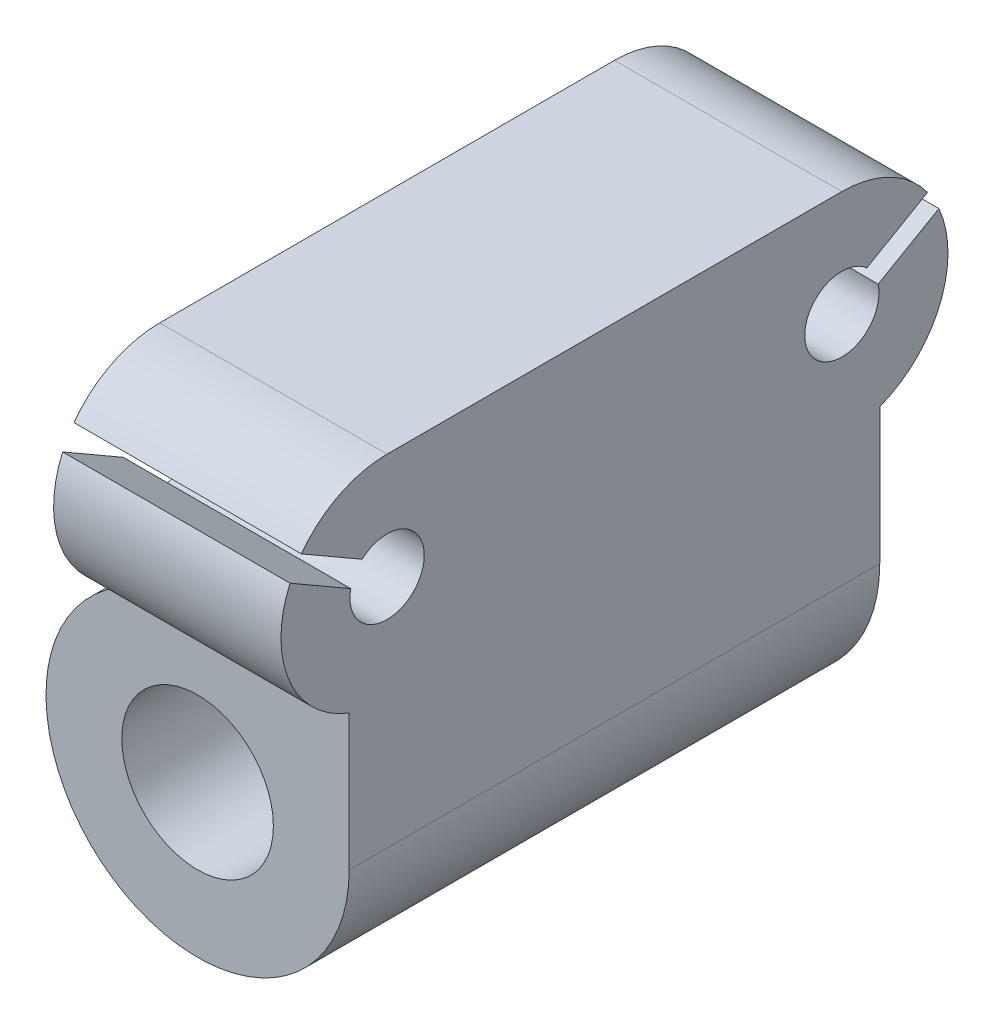
ISO-10303-21;
HEADER;
FILE_DESCRIPTION(('STEP AP214'),'2;1');
FILE_NAME('part.step','',(''),(''),'','','');
FILE_SCHEMA(('AUTOMOTIVE_DESIGN { 1 0 10303 214 1 1 1 1 }'));
ENDSEC;
DATA;
#1=APPLICATION_CONTEXT('core data for automotive mechanical design processes');
#2=APPLICATION_PROTOCOL_DEFINITION('international standard','automotive_design',2000,#1);
#3=PRODUCT_CONTEXT('',#1,'mechanical');
#4=PRODUCT('Part','Part','',(#3));
#5=PRODUCT_RELATED_PRODUCT_CATEGORY('part','',(#4));
#6=PRODUCT_DEFINITION_FORMATION('','',#4);
#7=PRODUCT_DEFINITION_CONTEXT('part definition',#1,'design');
#8=PRODUCT_DEFINITION('design','',#6,#7);
#9=PRODUCT_DEFINITION_SHAPE('','',#8);
#10=(LENGTH_UNIT() NAMED_UNIT(*) SI_UNIT(.MILLI.,.METRE.));
#11=(NAMED_UNIT(*) PLANE_ANGLE_UNIT() SI_UNIT($,.RADIAN.));
#12=(NAMED_UNIT(*) SI_UNIT($,.STERADIAN.) SOLID_ANGLE_UNIT());
#13=UNCERTAINTY_MEASURE_WITH_UNIT(LENGTH_MEASURE(1.E-05),#10,'distance_accuracy_value','');
#14=(GEOMETRIC_REPRESENTATION_CONTEXT(3) GLOBAL_UNCERTAINTY_ASSIGNED_CONTEXT((#13)) GLOBAL_UNIT_ASSIGNED_CONTEXT((#10,
#11,#12)) REPRESENTATION_CONTEXT('',''));
#15=CARTESIAN_POINT('',(0.,0.,0.));
#16=DIRECTION('',(0.,0.,1.));
#17=DIRECTION('',(1.,0.,0.));
#18=AXIS2_PLACEMENT_3D('',#15,#16,#17);
#19=CARTESIAN_POINT('',(10.,15.5,2.5));
#20=DIRECTION('',(-1.,0.,0.));
#21=DIRECTION('',(0.,-1.,0.));
#22=AXIS2_PLACEMENT_3D('',#19,#20,#21);
#23=CYLINDRICAL_SURFACE('',#22,7.);
#24=DIRECTION('',(-1.,0.,0.));
#25=VECTOR('',#24,1.);
#26=CARTESIAN_POINT('',(10.,19.6293717796071,-3.1522817256206));
#27=LINE('',#26,#25);
#28=CARTESIAN_POINT('',(-4.99999999999999,19.6293717796071,-3.1522817256206));
#29=VERTEX_POINT('',#28);
#30=CARTESIAN_POINT('',(10.,19.6293717796071,-3.1522817256206));
#31=VERTEX_POINT('',#30);
#32=EDGE_CURVE('E131',#29,#31,#27,.F.);
#33=ORIENTED_EDGE('',*,*,#32,.F.);
#34=CARTESIAN_POINT('',(-5.,15.5,2.5));
#35=DIRECTION('',(-1.,0.,0.));
#36=DIRECTION('',(0.,-1.,0.));
#37=AXIS2_PLACEMENT_3D('',#34,#35,#36);
#38=CIRCLE('',#37,7.);
#39=CARTESIAN_POINT('',(-4.99999999999999,22.5,2.5));
#40=VERTEX_POINT('',#39);
#41=EDGE_CURVE('E258',#40,#29,#38,.T.);
#42=ORIENTED_EDGE('',*,*,#41,.F.);
#43=DIRECTION('',(-1.,0.,0.));
#44=VECTOR('',#43,1.);
#45=CARTESIAN_POINT('',(10.,22.5,2.5));
#46=LINE('',#45,#44);
#47=CARTESIAN_POINT('',(10.,22.5,2.5));
#48=VERTEX_POINT('',#47);
#49=EDGE_CURVE('E153',#48,#40,#46,.T.);
#50=ORIENTED_EDGE('',*,*,#49,.F.);
#51=CARTESIAN_POINT('',(10.,15.5,2.5));
#52=DIRECTION('',(-1.,0.,0.));
#53=DIRECTION('',(0.,-1.,0.));
#54=AXIS2_PLACEMENT_3D('',#51,#52,#53);
#55=CIRCLE('',#54,7.);
#56=EDGE_CURVE('E146',#48,#31,#55,.T.);
#57=ORIENTED_EDGE('',*,*,#56,.T.);
#58=EDGE_LOOP('',(#33,#42,#50,#57));
#59=FACE_BOUND('',#58,.T.);
#60=ADVANCED_FACE('F32',(#59),#23,.T.);
#61=CARTESIAN_POINT('',(10.,15.5,32.5));
#62=DIRECTION('',(-1.,0.,0.));
#63=DIRECTION('',(0.,-1.,0.));
#64=AXIS2_PLACEMENT_3D('',#61,#62,#63);
#65=CYLINDRICAL_SURFACE('',#64,7.);
#66=DIRECTION('',(-1.,0.,0.));
#67=VECTOR('',#66,1.);
#68=CARTESIAN_POINT('',(10.,19.6293717796071,38.1522817256206));
#69=LINE('',#68,#67);
#70=CARTESIAN_POINT('',(10.,19.6293717796071,38.1522817256206));
#71=VERTEX_POINT('',#70);
#72=CARTESIAN_POINT('',(-4.99999999999999,19.6293717796071,38.1522817256206));
#73=VERTEX_POINT('',#72);
#74=EDGE_CURVE('E237',#71,#73,#69,.T.);
#75=ORIENTED_EDGE('',*,*,#74,.F.);
#76=CARTESIAN_POINT('',(10.,15.5,32.5));
#77=DIRECTION('',(-1.,0.,0.));
#78=DIRECTION('',(0.,-1.,0.));
#79=AXIS2_PLACEMENT_3D('',#76,#77,#78);
#80=CIRCLE('',#79,7.);
#81=CARTESIAN_POINT('',(10.,22.5,32.5));
#82=VERTEX_POINT('',#81);
#83=EDGE_CURVE('E154',#71,#82,#80,.T.);
#84=ORIENTED_EDGE('',*,*,#83,.T.);
#85=DIRECTION('',(-1.,0.,0.));
#86=VECTOR('',#85,1.);
#87=CARTESIAN_POINT('',(10.,22.5,32.5));
#88=LINE('',#87,#86);
#89=CARTESIAN_POINT('',(-4.99999999999999,22.5,32.5));
#90=VERTEX_POINT('',#89);
#91=EDGE_CURVE('E166',#82,#90,#88,.T.);
#92=ORIENTED_EDGE('',*,*,#91,.T.);
#93=CARTESIAN_POINT('',(-5.,15.5,32.5));
#94=DIRECTION('',(-1.,0.,0.));
#95=DIRECTION('',(0.,-1.,0.));
#96=AXIS2_PLACEMENT_3D('',#93,#94,#95);
#97=CIRCLE('',#96,7.);
#98=EDGE_CURVE('E240',#73,#90,#97,.T.);
#99=ORIENTED_EDGE('',*,*,#98,.F.);
#100=EDGE_LOOP('',(#75,#84,#92,#99));
#101=FACE_BOUND('',#100,.T.);
#102=ADVANCED_FACE('F189',(#101),#65,.T.);
#103=CARTESIAN_POINT('',(0.,0.,0.));
#104=DIRECTION('',(0.,0.,1.));
#105=DIRECTION('',(1.,0.,0.));
#106=AXIS2_PLACEMENT_3D('',#103,#104,#105);
#107=PLANE('',#106);
#108=CARTESIAN_POINT('',(0.,0.,0.));
#109=DIRECTION('',(0.,0.,1.));
#110=DIRECTION('',(1.,0.,0.));
#111=AXIS2_PLACEMENT_3D('',#108,#109,#110);
#112=CIRCLE('',#111,10.);
#113=CARTESIAN_POINT('',(-4.43720642686828,8.961651584689,0.));
#114=VERTEX_POINT('',#113);
#115=CARTESIAN_POINT('',(10.,0.,0.));
#116=VERTEX_POINT('',#115);
#117=EDGE_CURVE('E297',#114,#116,#112,.T.);
#118=ORIENTED_EDGE('',*,*,#117,.F.);
#119=DIRECTION('',(-1.,0.,0.));
#120=VECTOR('',#119,1.);
#121=CARTESIAN_POINT('',(10.,8.96165158468899,0.));
#122=LINE('',#121,#120);
#123=CARTESIAN_POINT('',(10.,8.96165158468899,0.));
#124=VERTEX_POINT('',#123);
#125=EDGE_CURVE('E320',#114,#124,#122,.F.);
#126=ORIENTED_EDGE('',*,*,#125,.T.);
#127=DIRECTION('',(0.,1.,0.));
#128=VECTOR('',#127,1.);
#129=CARTESIAN_POINT('',(10.,12.,0.));
#130=LINE('',#129,#128);
#131=EDGE_CURVE('E292',#116,#124,#130,.T.);
#132=ORIENTED_EDGE('',*,*,#131,.F.);
#133=EDGE_LOOP('',(#118,#126,#132));
#134=FACE_BOUND('',#133,.T.);
#135=CARTESIAN_POINT('',(0.,0.,0.));
#136=DIRECTION('',(0.,0.,1.));
#137=DIRECTION('',(1.,0.,0.));
#138=AXIS2_PLACEMENT_3D('',#135,#136,#137);
#139=CIRCLE('',#138,5.);
#140=CARTESIAN_POINT('',(5.,0.,0.));
#141=VERTEX_POINT('',#140);
#142=EDGE_CURVE('E301',#141,#141,#139,.T.);
#143=ORIENTED_EDGE('',*,*,#142,.T.);
#144=EDGE_LOOP('',(#143));
#145=FACE_BOUND('',#144,.T.);
#146=ADVANCED_FACE('F220',(#134,#145),#107,.F.);
#147=CARTESIAN_POINT('',(0.,0.,15.));
#148=DIRECTION('',(0.,0.,-1.));
#149=DIRECTION('',(-1.,0.,0.));
#150=AXIS2_PLACEMENT_3D('',#147,#148,#149);
#151=CYLINDRICAL_SURFACE('',#150,10.);
#152=DIRECTION('',(0.,0.,-1.));
#153=VECTOR('',#152,1.);
#154=CARTESIAN_POINT('',(-5.,8.66025403784439,15.));
#155=LINE('',#154,#153);
#156=CARTESIAN_POINT('',(-5.,8.66025403784439,33.9892532266797));
#157=VERTEX_POINT('',#156);
#158=CARTESIAN_POINT('',(-5.,8.66025403784439,1.0107467733203));
#159=VERTEX_POINT('',#158);
#160=EDGE_CURVE('E307',#157,#159,#155,.T.);
#161=ORIENTED_EDGE('',*,*,#160,.T.);
#162=CARTESIAN_POINT('',(0.,10.,6.83012701892219));
#163=CARTESIAN_POINT('',(-0.159285536581169,10.0000240749592,6.83010068400524));
#164=CARTESIAN_POINT('',(-0.318579521881655,9.99619505366448,6.8252919494851));
#165=CARTESIAN_POINT('',(-0.636265460919561,9.98099871756684,6.80591555210003));
#166=CARTESIAN_POINT('',(-0.794657083151019,9.96962879249385,6.79134451001245));
#167=CARTESIAN_POINT('',(-1.11055138359528,9.93941895499326,6.75211952397573));
#168=CARTESIAN_POINT('',(-1.26804120633403,9.92053001787747,6.72739937296773));
#169=CARTESIAN_POINT('',(-1.5799852396837,9.87565005217115,6.66750497286993));
#170=CARTESIAN_POINT('',(-1.73443973693079,9.84965969767994,6.63233171600945));
#171=CARTESIAN_POINT('',(-2.03965635319013,9.79101745243971,6.55093073860382));
#172=CARTESIAN_POINT('',(-2.19040562597617,9.7583452788368,6.50466928417913));
#173=CARTESIAN_POINT('',(-2.48643393890001,9.68714704419364,6.40060442061861));
#174=CARTESIAN_POINT('',(-2.63171366229081,9.64862171737385,6.34280245884055));
#175=CARTESIAN_POINT('',(-2.91502656183302,9.56683230180569,6.21527111150424));
#176=CARTESIAN_POINT('',(-3.05308006571003,9.52358269472148,6.1455778275153));
#177=CARTESIAN_POINT('',(-3.32085021420594,9.43355350165217,5.9937100514578));
#178=CARTESIAN_POINT('',(-3.45056957915447,9.38677507845176,5.91153966177479));
#179=CARTESIAN_POINT('',(-3.76436507213043,9.26662465684196,5.688775035512));
#180=CARTESIAN_POINT('',(-3.94214979637995,9.19193120036068,5.53984666713701));
#181=CARTESIAN_POINT('',(-4.26958960375021,9.04449761606714,5.21265285377202));
#182=CARTESIAN_POINT('',(-4.4192515179283,8.97175701759283,5.03439455283316));
#183=CARTESIAN_POINT('',(-4.61911700914336,8.86958003417728,4.74678200148933));
#184=CARTESIAN_POINT('',(-4.68180165952128,8.83657837820945,4.64717402822783));
#185=CARTESIAN_POINT('',(-4.7982451212605,8.77389330911268,4.44190063329431));
#186=CARTESIAN_POINT('',(-4.85200793707445,8.74420840926496,4.33623795800421));
#187=CARTESIAN_POINT('',(-4.95016288801224,8.68901983791034,4.11958382679643));
#188=CARTESIAN_POINT('',(-4.9945536954294,8.66351675894466,4.00859161858861));
#189=CARTESIAN_POINT('',(-5.07359883611428,8.61746424921465,3.78220000804186));
#190=CARTESIAN_POINT('',(-5.10825418169739,8.59691430344389,3.6668010653437));
#191=CARTESIAN_POINT('',(-5.16453142929958,8.56321065505971,3.44459747752463));
#192=CARTESIAN_POINT('',(-5.18712311413293,8.54951583994371,3.33811914985197));
#193=CARTESIAN_POINT('',(-5.2241203214549,8.52695950272027,3.12320255180967));
#194=CARTESIAN_POINT('',(-5.23852309716318,8.51809960241329,3.0147636363757));
#195=CARTESIAN_POINT('',(-5.25903610262079,8.50545028750099,2.79692739573547));
#196=CARTESIAN_POINT('',(-5.26515507131983,8.50165552951534,2.68753120325844));
#197=CARTESIAN_POINT('',(-5.26909565885739,8.49921390584813,2.46849262407644));
#198=CARTESIAN_POINT('',(-5.26691444760798,8.50056879602676,2.35885016614034));
#199=CARTESIAN_POINT('',(-5.25457696747006,8.50820008273864,2.14568924104742));
#200=CARTESIAN_POINT('',(-5.24482404882832,8.51422754486129,2.04213817618118));
#201=CARTESIAN_POINT('',(-5.21788386143233,8.53076418845414,1.836369836865));
#202=CARTESIAN_POINT('',(-5.20069663228618,8.54127334604701,1.734152555312));
#203=CARTESIAN_POINT('',(-5.15896020512079,8.5665468017578,1.53167935507928));
#204=CARTESIAN_POINT('',(-5.13440484749261,8.58131465966067,1.4314251524862));
#205=CARTESIAN_POINT('',(-5.0780799366756,8.614764967294,1.23366963844932));
#206=CARTESIAN_POINT('',(-5.04631259659419,8.63344621600485,1.13616749279293));
#207=CARTESIAN_POINT('',(-4.97621583577044,8.67403552377071,0.945794570202875));
#208=CARTESIAN_POINT('',(-4.93798039129137,8.69589681808487,0.852879148007061));
#209=CARTESIAN_POINT('',(-4.85487845275328,8.7425639989204,0.670821815743872));
#210=CARTESIAN_POINT('',(-4.81001131312369,8.76737017206831,0.581680274137587));
#211=CARTESIAN_POINT('',(-4.71396399472668,8.8193832049613,0.407731857292472));
#212=CARTESIAN_POINT('',(-4.66279025903223,8.84658760661953,0.322920681263477));
#213=CARTESIAN_POINT('',(-4.55442953945422,8.90285912331537,0.157915897270163));
#214=CARTESIAN_POINT('',(-4.49724425531008,8.93192571092494,0.0777209939461665));
#215=CARTESIAN_POINT('',(-4.43720642686832,8.961651584689,0.));
#216=B_SPLINE_CURVE_WITH_KNOTS('',3,(#162,#163,#164,#165,#166,#167,#168,#169,#170,#171,#172,
#173,#174,#175,#176,#177,#178,#179,#180,#181,#182,#183,#184,#185,#186,#187,#188,#189,#190,#191,
#192,#193,#194,#195,#196,#197,#198,#199,#200,#201,#202,#203,#204,#205,#206,#207,#208,#209,#210,
#211,#212,#213,#214,#215),.UNSPECIFIED.,.F.,.F.,(4,2,2,2,2,2,2,2,2,2,2,2,2,2,2,2,2,2,2,2,2,2,2,
2,2,2,4),(0.,0.47775187523151,0.955669209769702,1.43675503559307,1.9177952103842,
2.40031786770465,2.88278004720566,3.36380273830759,3.84466761359355,4.57244994148511,
5.30005526119392,5.66630842693191,6.03239675732493,6.39853691569718,6.76463898788226,
7.09334176530692,7.42215473353527,7.75062055159165,8.07919837570526,8.39138162494116,
8.70356321096504,9.01600650514239,9.32835405058972,9.63650180660839,9.94467957943223,
10.2525450756292,10.5603237571244),.UNSPECIFIED.);
#217=EDGE_CURVE('E176',#159,#114,#216,.T.);
#218=ORIENTED_EDGE('',*,*,#217,.T.);
#219=ORIENTED_EDGE('',*,*,#117,.T.);
#220=DIRECTION('',(0.,0.,-1.));
#221=VECTOR('',#220,1.);
#222=CARTESIAN_POINT('',(10.,0.,15.));
#223=LINE('',#222,#221);
#224=CARTESIAN_POINT('',(10.,0.,35.));
#225=VERTEX_POINT('',#224);
#226=EDGE_CURVE('E295',#225,#116,#223,.T.);
#227=ORIENTED_EDGE('',*,*,#226,.F.);
#228=CARTESIAN_POINT('',(0.,0.,35.));
#229=DIRECTION('',(0.,0.,1.));
#230=DIRECTION('',(1.,0.,0.));
#231=AXIS2_PLACEMENT_3D('',#228,#229,#230);
#232=CIRCLE('',#231,10.);
#233=CARTESIAN_POINT('',(-4.43720642686829,8.961651584689,35.));
#234=VERTEX_POINT('',#233);
#235=EDGE_CURVE('E327',#234,#225,#232,.T.);
#236=ORIENTED_EDGE('',*,*,#235,.F.);
#237=CARTESIAN_POINT('',(-4.43720642686828,8.961651584689,35.));
#238=CARTESIAN_POINT('',(-4.49983236729145,8.9306442708212,34.9189321149927));
#239=CARTESIAN_POINT('',(-4.55935328693936,8.90035498844151,34.8351695624002));
#240=CARTESIAN_POINT('',(-4.67184284287587,8.84182689712593,34.6626364399322));
#241=CARTESIAN_POINT('',(-4.72480932591941,8.81358876327923,34.5738642381723));
#242=CARTESIAN_POINT('',(-4.82386108697644,8.75976872347597,34.3916459242092));
#243=CARTESIAN_POINT('',(-4.86993867726907,8.73418979463446,34.2981947433699));
#244=CARTESIAN_POINT('',(-4.95484028099788,8.68630728293303,34.1072568245827));
#245=CARTESIAN_POINT('',(-4.99366521183587,8.66400328589764,34.0097705989431));
#246=CARTESIAN_POINT('',(-5.06390505816994,8.62313876481018,33.8111382817714));
#247=CARTESIAN_POINT('',(-5.09530281996425,8.6045869207297,33.7099843283512));
#248=CARTESIAN_POINT('',(-5.15039464414671,8.57172477525682,33.5048839914964));
#249=CARTESIAN_POINT('',(-5.17408592784804,8.55741600393224,33.400936615444));
#250=CARTESIAN_POINT('',(-5.21358674214507,8.53340774740528,33.1911739661975));
#251=CARTESIAN_POINT('',(-5.22940666304021,8.52370218670243,33.0853613473268));
#252=CARTESIAN_POINT('',(-5.25312888742001,8.50910287989978,32.8724829477056));
#253=CARTESIAN_POINT('',(-5.26102833853468,8.50421086729739,32.7654167295336));
#254=CARTESIAN_POINT('',(-5.26876699450233,8.49941845930732,32.5533528684955));
#255=CARTESIAN_POINT('',(-5.26878754460874,8.49940575888943,32.448364337825));
#256=CARTESIAN_POINT('',(-5.26122111596466,8.50409145815247,32.2387301657931));
#257=CARTESIAN_POINT('',(-5.25363135819889,8.50879157878896,32.1340846636981));
#258=CARTESIAN_POINT('',(-5.23087590268317,8.5227998767656,31.9259351573592));
#259=CARTESIAN_POINT('',(-5.21571082711089,8.53210767566633,31.8224310600826));
#260=CARTESIAN_POINT('',(-5.1778924870943,8.55511006570306,31.6172837592045));
#261=CARTESIAN_POINT('',(-5.15523644478165,8.56880628413428,31.5156412607172));
#262=CARTESIAN_POINT('',(-5.0766337384512,8.6157745438043,31.2163242378579));
#263=CARTESIAN_POINT('',(-5.00983617484021,8.6550672055484,31.0222952698879));
#264=CARTESIAN_POINT('',(-4.8487671443924,8.74631034355519,30.6494217766413));
#265=CARTESIAN_POINT('',(-4.75449782971693,8.7982598282189,30.4705760633117));
#266=CARTESIAN_POINT('',(-4.53632117515414,8.91277352668106,30.1244925427298));
#267=CARTESIAN_POINT('',(-4.41134457706325,8.97568925416248,29.95804646551));
#268=CARTESIAN_POINT('',(-4.13747523825379,9.10517576250799,29.647887226212));
#269=CARTESIAN_POINT('',(-3.98857397553898,9.1717478401866,29.504182200865));
#270=CARTESIAN_POINT('',(-3.65448839861346,9.31024040326066,29.2268771270135));
#271=CARTESIAN_POINT('',(-3.46715215334878,9.38201349144331,29.095804420056));
#272=CARTESIAN_POINT('',(-3.07335809634309,9.51829671160285,28.8616458380837));
#273=CARTESIAN_POINT('',(-2.86688818111618,9.58280218831816,28.7585778424694));
#274=CARTESIAN_POINT('',(-2.4059119421297,9.70965191243863,28.5645948304457));
#275=CARTESIAN_POINT('',(-2.14897551045736,9.77003740790354,28.4781867843122));
#276=CARTESIAN_POINT('',(-1.62266619608396,9.87111120739528,28.337896351865));
#277=CARTESIAN_POINT('',(-1.35328920399673,9.91179295113007,28.2840247969846));
#278=CARTESIAN_POINT('',(-0.902188917152374,9.96084322753008,28.2199675567505));
#279=CARTESIAN_POINT('',(-0.72230643551814,9.97551848119989,28.201121067706));
#280=CARTESIAN_POINT('',(-0.451692433501463,9.99020063369421,28.1823418028134));
#281=CARTESIAN_POINT('',(-0.361466096879094,9.99387286669241,28.1776637388813));
#282=CARTESIAN_POINT('',(-0.180828805533653,9.99877368750893,28.1714305214318));
#283=CARTESIAN_POINT('',(-0.0904178306683124,10.0000019927011,28.1698757291026));
#284=CARTESIAN_POINT('',(0.,10.,28.1698729810778));
#285=B_SPLINE_CURVE_WITH_KNOTS('',3,(#237,#238,#239,#240,#241,#242,#243,#244,#245,#246,#247,
#248,#249,#250,#251,#252,#253,#254,#255,#256,#257,#258,#259,#260,#261,#262,#263,#264,#265,#266,
#267,#268,#269,#270,#271,#272,#273,#274,#275,#276,#277,#278,#279,#280,#281,#282,#283,#284),
.UNSPECIFIED.,.F.,.F.,(4,2,2,2,2,2,2,2,2,2,2,2,2,2,2,2,2,2,2,2,2,2,2,4),(0.,0.321034668232999,
0.642174523454456,0.963670124575646,1.28512503156814,1.60731527234403,1.92962155522826,
2.25150125346001,2.57349682746876,2.88808071329881,3.20277951588824,3.51745247581485,
3.83224225674646,4.45595098360454,5.07961086169662,5.72919939891469,6.37901983546367,
7.0951471214878,7.81173054506897,8.64175527042939,9.47205615983677,10.0157448824874,
10.286931407463,10.558149291776),.UNSPECIFIED.);
#286=EDGE_CURVE('E168',#234,#157,#285,.T.);
#287=ORIENTED_EDGE('',*,*,#286,.T.);
#288=EDGE_LOOP('',(#161,#218,#219,#227,#236,#287));
#289=FACE_BOUND('',#288,.T.);
#290=ADVANCED_FACE('F34',(#289),#151,.T.);
#291=CARTESIAN_POINT('',(10.,12.,15.));
#292=DIRECTION('',(-1.,0.,0.));
#293=DIRECTION('',(0.,0.,1.));
#294=AXIS2_PLACEMENT_3D('',#291,#292,#293);
#295=PLANE('',#294);
#296=CARTESIAN_POINT('',(10.,15.5,2.5));
#297=DIRECTION('',(-1.,0.,0.));
#298=DIRECTION('',(0.,0.,1.));
#299=AXIS2_PLACEMENT_3D('',#296,#297,#298);
#300=CIRCLE('',#299,2.45);
#301=CARTESIAN_POINT('',(10.,16.0166713261307,0.105099012327585));
#302=VERTEX_POINT('',#301);
#303=CARTESIAN_POINT('',(10.,17.3157094318074,0.855099012327578));
#304=VERTEX_POINT('',#303);
#305=EDGE_CURVE('E149',#302,#304,#300,.T.);
#306=ORIENTED_EDGE('',*,*,#305,.T.);
#307=DIRECTION('',(0.,-0.499999999999999,0.866025403784439));
#308=VECTOR('',#307,1.);
#309=CARTESIAN_POINT('',(10.,16.1495190528383,2.875));
#310=LINE('',#309,#308);
#311=EDGE_CURVE('E56',#31,#304,#310,.T.);
#312=ORIENTED_EDGE('',*,*,#311,.F.);
#313=ORIENTED_EDGE('',*,*,#56,.F.);
#314=DIRECTION('',(0.,0.,-1.));
#315=VECTOR('',#314,1.);
#316=CARTESIAN_POINT('',(10.,22.5,25.5));
#317=LINE('',#316,#315);
#318=EDGE_CURVE('E164',#82,#48,#317,.T.);
#319=ORIENTED_EDGE('',*,*,#318,.F.);
#320=ORIENTED_EDGE('',*,*,#83,.F.);
#321=DIRECTION('',(0.,0.499999999999998,0.86602540378444));
#322=VECTOR('',#321,1.);
#323=CARTESIAN_POINT('',(10.,16.1495190528383,32.125));
#324=LINE('',#323,#322);
#325=CARTESIAN_POINT('',(10.,17.3157094318074,34.1449009876724));
#326=VERTEX_POINT('',#325);
#327=EDGE_CURVE('E139',#326,#71,#324,.T.);
#328=ORIENTED_EDGE('',*,*,#327,.F.);
#329=CARTESIAN_POINT('',(10.,15.5,32.5));
#330=DIRECTION('',(-1.,0.,0.));
#331=DIRECTION('',(0.,0.,1.));
#332=AXIS2_PLACEMENT_3D('',#329,#330,#331);
#333=CIRCLE('',#332,2.45);
#334=CARTESIAN_POINT('',(10.,16.0166713261307,34.8949009876724));
#335=VERTEX_POINT('',#334);
#336=EDGE_CURVE('E265',#326,#335,#333,.T.);
#337=ORIENTED_EDGE('',*,*,#336,.T.);
#338=DIRECTION('',(0.,-0.499999999999997,-0.86602540378444));
#339=VECTOR('',#338,1.);
#340=CARTESIAN_POINT('',(10.,14.8504809471617,32.875));
#341=LINE('',#340,#339);
#342=CARTESIAN_POINT('',(10.,18.3303336739304,38.9022817256206));
#343=VERTEX_POINT('',#342);
#344=EDGE_CURVE('E275',#343,#335,#341,.T.);
#345=ORIENTED_EDGE('',*,*,#344,.F.);
#346=CARTESIAN_POINT('',(10.,8.96165158468899,35.));
#347=VERTEX_POINT('',#346);
#348=EDGE_CURVE('E157',#347,#343,#80,.T.);
#349=ORIENTED_EDGE('',*,*,#348,.F.);
#350=DIRECTION('',(0.,1.,0.));
#351=VECTOR('',#350,1.);
#352=CARTESIAN_POINT('',(10.,12.,35.));
#353=LINE('',#352,#351);
#354=EDGE_CURVE('E330',#225,#347,#353,.T.);
#355=ORIENTED_EDGE('',*,*,#354,.F.);
#356=ORIENTED_EDGE('',*,*,#226,.T.);
#357=ORIENTED_EDGE('',*,*,#131,.T.);
#358=CARTESIAN_POINT('',(10.,18.3303336739304,-3.9022817256206));
#359=VERTEX_POINT('',#358);
#360=EDGE_CURVE('E155',#359,#124,#55,.T.);
#361=ORIENTED_EDGE('',*,*,#360,.F.);
#362=DIRECTION('',(0.,0.499999999999998,-0.866025403784439));
#363=VECTOR('',#362,1.);
#364=CARTESIAN_POINT('',(10.,14.8504809471617,2.125));
#365=LINE('',#364,#363);
#366=EDGE_CURVE('E150',#302,#359,#365,.T.);
#367=ORIENTED_EDGE('',*,*,#366,.F.);
#368=EDGE_LOOP('',(#306,#312,#313,#319,#320,#328,#337,#345,#349,#355,#356,#357,#361,#367));
#369=FACE_BOUND('',#368,.T.);
#370=ADVANCED_FACE('F144',(#369),#295,.F.);
#371=CARTESIAN_POINT('',(0.,0.,15.));
#372=DIRECTION('',(0.,0.,-1.));
#373=DIRECTION('',(-1.,0.,0.));
#374=AXIS2_PLACEMENT_3D('',#371,#372,#373);
#375=CYLINDRICAL_SURFACE('',#374,5.);
#376=CARTESIAN_POINT('',(0.,0.,15.));
#377=DIRECTION('',(0.,0.,-1.));
#378=DIRECTION('',(-1.,0.,0.));
#379=AXIS2_PLACEMENT_3D('',#376,#377,#378);
#380=CIRCLE('',#379,5.);
#381=CARTESIAN_POINT('',(-5.,0.,15.));
#382=VERTEX_POINT('',#381);
#383=EDGE_CURVE('E336',#382,#382,#380,.T.);
#384=ORIENTED_EDGE('',*,*,#383,.F.);
#385=EDGE_LOOP('',(#384));
#386=FACE_BOUND('',#385,.T.);
#387=ORIENTED_EDGE('',*,*,#142,.F.);
#388=EDGE_LOOP('',(#387));
#389=FACE_BOUND('',#388,.T.);
#390=ADVANCED_FACE('F212',(#386,#389),#375,.F.);
#391=CARTESIAN_POINT('',(0.,0.,20.));
#392=DIRECTION('',(0.,0.,-1.));
#393=DIRECTION('',(-1.,0.,0.));
#394=AXIS2_PLACEMENT_3D('',#391,#392,#393);
#395=PLANE('',#394);
#396=CARTESIAN_POINT('',(0.,0.,20.));
#397=DIRECTION('',(0.,0.,1.));
#398=DIRECTION('',(1.,0.,0.));
#399=AXIS2_PLACEMENT_3D('',#396,#397,#398);
#400=CIRCLE('',#399,5.);
#401=CARTESIAN_POINT('',(5.,0.,20.));
#402=VERTEX_POINT('',#401);
#403=EDGE_CURVE('E321',#402,#402,#400,.T.);
#404=ORIENTED_EDGE('',*,*,#403,.T.);
#405=EDGE_LOOP('',(#404));
#406=FACE_BOUND('',#405,.T.);
#407=CARTESIAN_POINT('',(0.,0.,20.));
#408=DIRECTION('',(0.,0.,1.));
#409=DIRECTION('',(1.,0.,0.));
#410=AXIS2_PLACEMENT_3D('',#407,#408,#409);
#411=CIRCLE('',#410,3.5);
#412=CARTESIAN_POINT('',(3.5,0.,20.));
#413=VERTEX_POINT('',#412);
#414=EDGE_CURVE('E333',#413,#413,#411,.T.);
#415=ORIENTED_EDGE('',*,*,#414,.F.);
#416=EDGE_LOOP('',(#415));
#417=FACE_BOUND('',#416,.T.);
#418=ADVANCED_FACE('F209',(#406,#417),#395,.F.);
#419=CARTESIAN_POINT('',(0.,0.,15.));
#420=DIRECTION('',(0.,0.,-1.));
#421=DIRECTION('',(-1.,0.,0.));
#422=AXIS2_PLACEMENT_3D('',#419,#420,#421);
#423=PLANE('',#422);
#424=ORIENTED_EDGE('',*,*,#383,.T.);
#425=EDGE_LOOP('',(#424));
#426=FACE_BOUND('',#425,.T.);
#427=CARTESIAN_POINT('',(0.,0.,15.));
#428=DIRECTION('',(0.,0.,1.));
#429=DIRECTION('',(1.,0.,0.));
#430=AXIS2_PLACEMENT_3D('',#427,#428,#429);
#431=CIRCLE('',#430,3.5);
#432=CARTESIAN_POINT('',(3.5,0.,15.));
#433=VERTEX_POINT('',#432);
#434=EDGE_CURVE('E332',#433,#433,#431,.T.);
#435=ORIENTED_EDGE('',*,*,#434,.T.);
#436=EDGE_LOOP('',(#435));
#437=FACE_BOUND('',#436,.T.);
#438=ADVANCED_FACE('F207',(#426,#437),#423,.T.);
#439=CARTESIAN_POINT('',(0.,0.,20.));
#440=DIRECTION('',(0.,0.,-1.));
#441=DIRECTION('',(-1.,0.,0.));
#442=AXIS2_PLACEMENT_3D('',#439,#440,#441);
#443=CYLINDRICAL_SURFACE('',#442,3.5);
#444=ORIENTED_EDGE('',*,*,#414,.T.);
#445=EDGE_LOOP('',(#444));
#446=FACE_BOUND('',#445,.T.);
#447=ORIENTED_EDGE('',*,*,#434,.F.);
#448=EDGE_LOOP('',(#447));
#449=FACE_BOUND('',#448,.T.);
#450=ADVANCED_FACE('F203',(#446,#449),#443,.F.);
#451=CARTESIAN_POINT('',(0.,0.,35.));
#452=DIRECTION('',(0.,0.,1.));
#453=DIRECTION('',(1.,0.,0.));
#454=AXIS2_PLACEMENT_3D('',#451,#452,#453);
#455=PLANE('',#454);
#456=DIRECTION('',(-1.,0.,0.));
#457=VECTOR('',#456,1.);
#458=CARTESIAN_POINT('',(10.,8.96165158468899,35.));
#459=LINE('',#458,#457);
#460=EDGE_CURVE('E299',#234,#347,#459,.F.);
#461=ORIENTED_EDGE('',*,*,#460,.F.);
#462=ORIENTED_EDGE('',*,*,#235,.T.);
#463=ORIENTED_EDGE('',*,*,#354,.T.);
#464=EDGE_LOOP('',(#461,#462,#463));
#465=FACE_BOUND('',#464,.T.);
#466=CARTESIAN_POINT('',(0.,0.,35.));
#467=DIRECTION('',(0.,0.,1.));
#468=DIRECTION('',(1.,0.,0.));
#469=AXIS2_PLACEMENT_3D('',#466,#467,#468);
#470=CIRCLE('',#469,5.);
#471=CARTESIAN_POINT('',(5.,0.,35.));
#472=VERTEX_POINT('',#471);
#473=EDGE_CURVE('E323',#472,#472,#470,.T.);
#474=ORIENTED_EDGE('',*,*,#473,.F.);
#475=EDGE_LOOP('',(#474));
#476=FACE_BOUND('',#475,.T.);
#477=ADVANCED_FACE('F199',(#465,#476),#455,.T.);
#478=CARTESIAN_POINT('',(0.,0.,35.));
#479=DIRECTION('',(0.,0.,-1.));
#480=DIRECTION('',(-1.,0.,0.));
#481=AXIS2_PLACEMENT_3D('',#478,#479,#480);
#482=CYLINDRICAL_SURFACE('',#481,5.);
#483=ORIENTED_EDGE('',*,*,#473,.T.);
#484=EDGE_LOOP('',(#483));
#485=FACE_BOUND('',#484,.T.);
#486=ORIENTED_EDGE('',*,*,#403,.F.);
#487=EDGE_LOOP('',(#486));
#488=FACE_BOUND('',#487,.T.);
#489=ADVANCED_FACE('F196',(#485,#488),#482,.F.);
#490=CARTESIAN_POINT('',(-5.,15.5,2.5));
#491=DIRECTION('',(-1.,0.,0.));
#492=DIRECTION('',(0.,-1.,0.));
#493=AXIS2_PLACEMENT_3D('',#490,#491,#492);
#494=PLANE('',#493);
#495=DIRECTION('',(0.,0.499999999999999,-0.866025403784439));
#496=VECTOR('',#495,1.);
#497=CARTESIAN_POINT('',(-5.,16.1495190528383,2.875));
#498=LINE('',#497,#496);
#499=CARTESIAN_POINT('',(-5.,17.3157094318074,0.855099012327579));
#500=VERTEX_POINT('',#499);
#501=EDGE_CURVE('E134',#500,#29,#498,.T.);
#502=ORIENTED_EDGE('',*,*,#501,.F.);
#503=CARTESIAN_POINT('',(-5.,15.5,2.5));
#504=DIRECTION('',(-1.,0.,0.));
#505=DIRECTION('',(0.,0.,1.));
#506=AXIS2_PLACEMENT_3D('',#503,#504,#505);
#507=CIRCLE('',#506,2.45);
#508=CARTESIAN_POINT('',(-5.,16.0166713261307,0.105099012327585));
#509=VERTEX_POINT('',#508);
#510=EDGE_CURVE('E262',#509,#500,#507,.T.);
#511=ORIENTED_EDGE('',*,*,#510,.F.);
#512=DIRECTION('',(0.,-0.499999999999998,0.86602540378444));
#513=VECTOR('',#512,1.);
#514=CARTESIAN_POINT('',(-5.,14.8504809471617,2.125));
#515=LINE('',#514,#513);
#516=CARTESIAN_POINT('',(-4.99999999999999,18.3303336739304,-3.9022817256206));
#517=VERTEX_POINT('',#516);
#518=EDGE_CURVE('E48',#517,#509,#515,.T.);
#519=ORIENTED_EDGE('',*,*,#518,.F.);
#520=EDGE_CURVE('E261',#517,#159,#38,.T.);
#521=ORIENTED_EDGE('',*,*,#520,.T.);
#522=ORIENTED_EDGE('',*,*,#160,.F.);
#523=CARTESIAN_POINT('',(-4.99999999999999,18.3303336739304,38.9022817256206));
#524=VERTEX_POINT('',#523);
#525=EDGE_CURVE('E253',#157,#524,#97,.T.);
#526=ORIENTED_EDGE('',*,*,#525,.T.);
#527=DIRECTION('',(0.,0.499999999999997,0.86602540378444));
#528=VECTOR('',#527,1.);
#529=CARTESIAN_POINT('',(-5.,1.86009989039514,10.3749999999999));
#530=LINE('',#529,#528);
#531=CARTESIAN_POINT('',(-5.,16.0166713261307,34.8949009876724));
#532=VERTEX_POINT('',#531);
#533=EDGE_CURVE('E273',#532,#524,#530,.T.);
#534=ORIENTED_EDGE('',*,*,#533,.F.);
#535=CARTESIAN_POINT('',(-5.,15.5,32.5));
#536=DIRECTION('',(-1.,0.,0.));
#537=DIRECTION('',(0.,0.,1.));
#538=AXIS2_PLACEMENT_3D('',#535,#536,#537);
#539=CIRCLE('',#538,2.45);
#540=CARTESIAN_POINT('',(-5.,17.3157094318074,34.1449009876724));
#541=VERTEX_POINT('',#540);
#542=EDGE_CURVE('E243',#541,#532,#539,.T.);
#543=ORIENTED_EDGE('',*,*,#542,.F.);
#544=DIRECTION('',(0.,-0.499999999999998,-0.86602540378444));
#545=VECTOR('',#544,1.);
#546=CARTESIAN_POINT('',(-5.,3.15913799607179,9.62499999999994));
#547=LINE('',#546,#545);
#548=EDGE_CURVE('E244',#73,#541,#547,.T.);
#549=ORIENTED_EDGE('',*,*,#548,.F.);
#550=ORIENTED_EDGE('',*,*,#98,.T.);
#551=DIRECTION('',(0.,0.,-1.));
#552=VECTOR('',#551,1.);
#553=CARTESIAN_POINT('',(-4.99999999999999,22.5,25.5));
#554=LINE('',#553,#552);
#555=EDGE_CURVE('E159',#90,#40,#554,.T.);
#556=ORIENTED_EDGE('',*,*,#555,.T.);
#557=ORIENTED_EDGE('',*,*,#41,.T.);
#558=EDGE_LOOP('',(#502,#511,#519,#521,#522,#526,#534,#543,#549,#550,#556,#557));
#559=FACE_BOUND('',#558,.T.);
#560=ADVANCED_FACE('F194',(#559),#494,.T.);
#561=DIRECTION('',(-1.,0.,0.));
#562=VECTOR('',#561,1.);
#563=CARTESIAN_POINT('',(10.,18.3303336739304,-3.9022817256206));
#564=LINE('',#563,#562);
#565=EDGE_CURVE('E279',#359,#517,#564,.T.);
#566=ORIENTED_EDGE('',*,*,#565,.F.);
#567=ORIENTED_EDGE('',*,*,#360,.T.);
#568=ORIENTED_EDGE('',*,*,#125,.F.);
#569=ORIENTED_EDGE('',*,*,#217,.F.);
#570=ORIENTED_EDGE('',*,*,#520,.F.);
#571=EDGE_LOOP('',(#566,#567,#568,#569,#570));
#572=FACE_BOUND('',#571,.T.);
#573=ADVANCED_FACE('F187',(#572),#23,.T.);
#574=DIRECTION('',(-1.,0.,0.));
#575=VECTOR('',#574,1.);
#576=CARTESIAN_POINT('',(10.,18.3303336739304,38.9022817256206));
#577=LINE('',#576,#575);
#578=EDGE_CURVE('E271',#524,#343,#577,.F.);
#579=ORIENTED_EDGE('',*,*,#578,.F.);
#580=ORIENTED_EDGE('',*,*,#525,.F.);
#581=ORIENTED_EDGE('',*,*,#286,.F.);
#582=ORIENTED_EDGE('',*,*,#460,.T.);
#583=ORIENTED_EDGE('',*,*,#348,.T.);
#584=EDGE_LOOP('',(#579,#580,#581,#582,#583));
#585=FACE_BOUND('',#584,.T.);
#586=ADVANCED_FACE('F182',(#585),#65,.T.);
#587=CARTESIAN_POINT('',(10.,22.5,9.5));
#588=DIRECTION('',(0.,1.,0.));
#589=DIRECTION('',(0.,0.,1.));
#590=AXIS2_PLACEMENT_3D('',#587,#588,#589);
#591=PLANE('',#590);
#592=ORIENTED_EDGE('',*,*,#49,.T.);
#593=ORIENTED_EDGE('',*,*,#555,.F.);
#594=ORIENTED_EDGE('',*,*,#91,.F.);
#595=ORIENTED_EDGE('',*,*,#318,.T.);
#596=EDGE_LOOP('',(#592,#593,#594,#595));
#597=FACE_BOUND('',#596,.T.);
#598=ADVANCED_FACE('F186',(#597),#591,.T.);
#599=CARTESIAN_POINT('',(10.,15.5,2.5));
#600=DIRECTION('',(-1.,0.,0.));
#601=DIRECTION('',(0.,0.,1.));
#602=AXIS2_PLACEMENT_3D('',#599,#600,#601);
#603=CYLINDRICAL_SURFACE('',#602,2.45);
#604=ORIENTED_EDGE('',*,*,#510,.T.);
#605=DIRECTION('',(-1.,0.,0.));
#606=VECTOR('',#605,1.);
#607=CARTESIAN_POINT('',(10.,17.3157094318074,0.855099012327579));
#608=LINE('',#607,#606);
#609=EDGE_CURVE('E11',#500,#304,#608,.F.);
#610=ORIENTED_EDGE('',*,*,#609,.T.);
#611=ORIENTED_EDGE('',*,*,#305,.F.);
#612=DIRECTION('',(-1.,0.,0.));
#613=VECTOR('',#612,1.);
#614=CARTESIAN_POINT('',(10.,16.0166713261307,0.105099012327584));
#615=LINE('',#614,#613);
#616=EDGE_CURVE('E41',#302,#509,#615,.T.);
#617=ORIENTED_EDGE('',*,*,#616,.T.);
#618=EDGE_LOOP('',(#604,#610,#611,#617));
#619=FACE_BOUND('',#618,.T.);
#620=ADVANCED_FACE('F317',(#619),#603,.F.);
#621=CARTESIAN_POINT('',(10.,15.5,32.5));
#622=DIRECTION('',(-1.,0.,0.));
#623=DIRECTION('',(0.,0.,1.));
#624=AXIS2_PLACEMENT_3D('',#621,#622,#623);
#625=CYLINDRICAL_SURFACE('',#624,2.45);
#626=ORIENTED_EDGE('',*,*,#336,.F.);
#627=DIRECTION('',(-1.,0.,0.));
#628=VECTOR('',#627,1.);
#629=CARTESIAN_POINT('',(10.,17.3157094318074,34.1449009876724));
#630=LINE('',#629,#628);
#631=EDGE_CURVE('E313',#326,#541,#630,.T.);
#632=ORIENTED_EDGE('',*,*,#631,.T.);
#633=ORIENTED_EDGE('',*,*,#542,.T.);
#634=DIRECTION('',(-1.,0.,0.));
#635=VECTOR('',#634,1.);
#636=CARTESIAN_POINT('',(10.,16.0166713261307,34.8949009876724));
#637=LINE('',#636,#635);
#638=EDGE_CURVE('E310',#532,#335,#637,.F.);
#639=ORIENTED_EDGE('',*,*,#638,.T.);
#640=EDGE_LOOP('',(#626,#632,#633,#639));
#641=FACE_BOUND('',#640,.T.);
#642=ADVANCED_FACE('F357',(#641),#625,.F.);
#643=CARTESIAN_POINT('',(-10.,14.8504809471617,32.875));
#644=DIRECTION('',(0.,-0.86602540378444,0.499999999999997));
#645=DIRECTION('',(0.,-0.499999999999997,-0.86602540378444));
#646=AXIS2_PLACEMENT_3D('',#643,#644,#645);
#647=PLANE('',#646);
#648=ORIENTED_EDGE('',*,*,#578,.T.);
#649=ORIENTED_EDGE('',*,*,#344,.T.);
#650=ORIENTED_EDGE('',*,*,#638,.F.);
#651=ORIENTED_EDGE('',*,*,#533,.T.);
#652=EDGE_LOOP('',(#648,#649,#650,#651));
#653=FACE_BOUND('',#652,.T.);
#654=ADVANCED_FACE('F355',(#653),#647,.F.);
#655=CARTESIAN_POINT('',(-10.,16.1495190528383,32.125));
#656=DIRECTION('',(0.,0.86602540378444,-0.499999999999998));
#657=DIRECTION('',(0.,0.499999999999998,0.86602540378444));
#658=AXIS2_PLACEMENT_3D('',#655,#656,#657);
#659=PLANE('',#658);
#660=ORIENTED_EDGE('',*,*,#74,.T.);
#661=ORIENTED_EDGE('',*,*,#548,.T.);
#662=ORIENTED_EDGE('',*,*,#631,.F.);
#663=ORIENTED_EDGE('',*,*,#327,.T.);
#664=EDGE_LOOP('',(#660,#661,#662,#663));
#665=FACE_BOUND('',#664,.T.);
#666=ADVANCED_FACE('F359',(#665),#659,.F.);
#667=CARTESIAN_POINT('',(-10.,14.8504809471617,2.125));
#668=DIRECTION('',(0.,-0.86602540378444,-0.499999999999998));
#669=DIRECTION('',(0.,0.499999999999998,-0.86602540378444));
#670=AXIS2_PLACEMENT_3D('',#667,#668,#669);
#671=PLANE('',#670);
#672=ORIENTED_EDGE('',*,*,#565,.T.);
#673=ORIENTED_EDGE('',*,*,#518,.T.);
#674=ORIENTED_EDGE('',*,*,#616,.F.);
#675=ORIENTED_EDGE('',*,*,#366,.T.);
#676=EDGE_LOOP('',(#672,#673,#674,#675));
#677=FACE_BOUND('',#676,.T.);
#678=ADVANCED_FACE('F283',(#677),#671,.F.);
#679=CARTESIAN_POINT('',(-10.,16.1495190528383,2.875));
#680=DIRECTION('',(0.,0.866025403784439,0.499999999999999));
#681=DIRECTION('',(0.,-0.499999999999999,0.866025403784439));
#682=AXIS2_PLACEMENT_3D('',#679,#680,#681);
#683=PLANE('',#682);
#684=ORIENTED_EDGE('',*,*,#32,.T.);
#685=ORIENTED_EDGE('',*,*,#311,.T.);
#686=ORIENTED_EDGE('',*,*,#609,.F.);
#687=ORIENTED_EDGE('',*,*,#501,.T.);
#688=EDGE_LOOP('',(#684,#685,#686,#687));
#689=FACE_BOUND('',#688,.T.);
#690=ADVANCED_FACE('F132',(#689),#683,.F.);
#691=CLOSED_SHELL('',(#60,#102,#146,#290,#370,#390,#418,#438,#450,#477,#489,#560,#573,#586,#598,
#620,#642,#654,#666,#678,#690));
#692=MANIFOLD_SOLID_BREP('B2',#691);
#693=ADVANCED_BREP_SHAPE_REPRESENTATION('',(#18,#692),#14);
#694=SHAPE_DEFINITION_REPRESENTATION(#9,#693);
ENDSEC;
END-ISO-10303-21;
